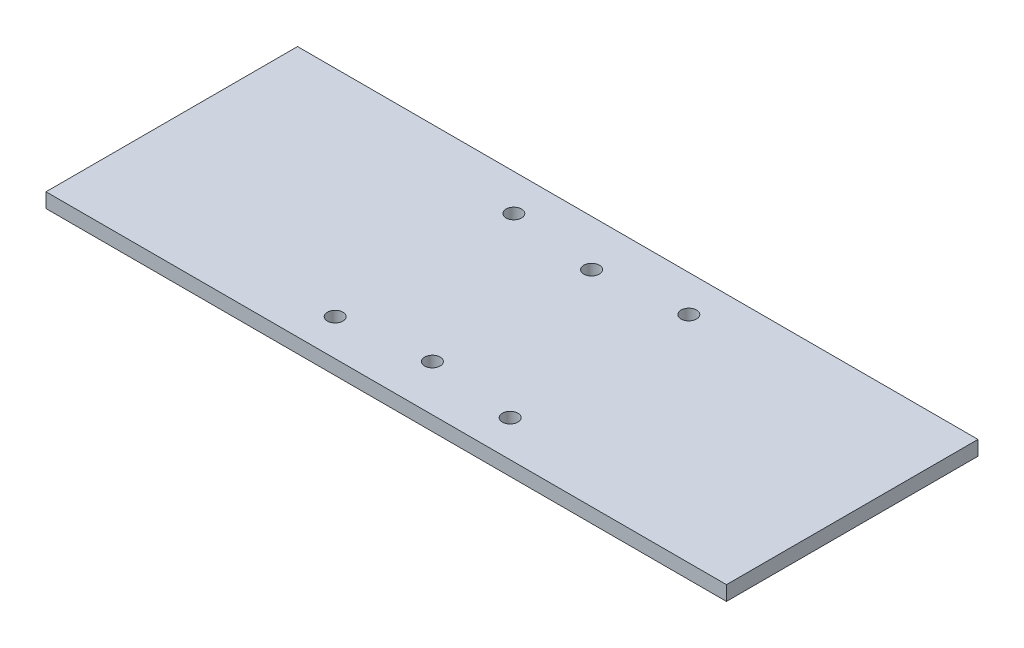
ISO-10303-21;
HEADER;
FILE_DESCRIPTION(('STEP AP214'),'2;1');
FILE_NAME('part.step','',(''),(''),'','','');
FILE_SCHEMA(('AUTOMOTIVE_DESIGN { 1 0 10303 214 1 1 1 1 }'));
ENDSEC;
DATA;
#1=APPLICATION_CONTEXT('core data for automotive mechanical design processes');
#2=APPLICATION_PROTOCOL_DEFINITION('international standard','automotive_design',2000,#1);
#3=PRODUCT_CONTEXT('',#1,'mechanical');
#4=PRODUCT('Part','Part','',(#3));
#5=PRODUCT_RELATED_PRODUCT_CATEGORY('part','',(#4));
#6=PRODUCT_DEFINITION_FORMATION('','',#4);
#7=PRODUCT_DEFINITION_CONTEXT('part definition',#1,'design');
#8=PRODUCT_DEFINITION('design','',#6,#7);
#9=PRODUCT_DEFINITION_SHAPE('','',#8);
#10=(LENGTH_UNIT() NAMED_UNIT(*) SI_UNIT(.MILLI.,.METRE.));
#11=(NAMED_UNIT(*) PLANE_ANGLE_UNIT() SI_UNIT($,.RADIAN.));
#12=(NAMED_UNIT(*) SI_UNIT($,.STERADIAN.) SOLID_ANGLE_UNIT());
#13=UNCERTAINTY_MEASURE_WITH_UNIT(LENGTH_MEASURE(1.E-05),#10,'distance_accuracy_value','');
#14=(GEOMETRIC_REPRESENTATION_CONTEXT(3) GLOBAL_UNCERTAINTY_ASSIGNED_CONTEXT((#13)) GLOBAL_UNIT_ASSIGNED_CONTEXT((#10,
#11,#12)) REPRESENTATION_CONTEXT('',''));
#15=CARTESIAN_POINT('',(0.,0.,0.));
#16=DIRECTION('',(0.,0.,1.));
#17=DIRECTION('',(1.,0.,0.));
#18=AXIS2_PLACEMENT_3D('',#15,#16,#17);
#19=CARTESIAN_POINT('',(-41.9495652376171,3.,-51.75));
#20=DIRECTION('',(1.,0.,0.));
#21=DIRECTION('',(0.,0.,-1.));
#22=AXIS2_PLACEMENT_3D('',#19,#20,#21);
#23=PLANE('',#22);
#24=DIRECTION('',(0.,0.,1.));
#25=VECTOR('',#24,1.);
#26=CARTESIAN_POINT('',(-41.9495652376171,0.,-51.75));
#27=LINE('',#26,#25);
#28=CARTESIAN_POINT('',(-41.9495652376171,0.,-51.75));
#29=VERTEX_POINT('',#28);
#30=CARTESIAN_POINT('',(-41.9495652376171,0.,0.));
#31=VERTEX_POINT('',#30);
#32=EDGE_CURVE('E105',#29,#31,#27,.T.);
#33=ORIENTED_EDGE('',*,*,#32,.T.);
#34=DIRECTION('',(0.,-1.,0.));
#35=VECTOR('',#34,1.);
#36=CARTESIAN_POINT('',(-41.9495652376171,3.,0.));
#37=LINE('',#36,#35);
#38=CARTESIAN_POINT('',(-41.9495652376171,3.,0.));
#39=VERTEX_POINT('',#38);
#40=EDGE_CURVE('E11',#39,#31,#37,.T.);
#41=ORIENTED_EDGE('',*,*,#40,.F.);
#42=DIRECTION('',(0.,0.,1.));
#43=VECTOR('',#42,1.);
#44=CARTESIAN_POINT('',(-41.9495652376171,3.,-51.75));
#45=LINE('',#44,#43);
#46=CARTESIAN_POINT('',(-41.9495652376171,3.,-51.75));
#47=VERTEX_POINT('',#46);
#48=EDGE_CURVE('E92',#47,#39,#45,.T.);
#49=ORIENTED_EDGE('',*,*,#48,.F.);
#50=DIRECTION('',(0.,-1.,0.));
#51=VECTOR('',#50,1.);
#52=CARTESIAN_POINT('',(-41.9495652376171,3.,-51.75));
#53=LINE('',#52,#51);
#54=EDGE_CURVE('E101',#47,#29,#53,.T.);
#55=ORIENTED_EDGE('',*,*,#54,.T.);
#56=EDGE_LOOP('',(#33,#41,#49,#55));
#57=FACE_BOUND('',#56,.T.);
#58=ADVANCED_FACE('F39',(#57),#23,.F.);
#59=CARTESIAN_POINT('',(-41.9495652376171,3.,0.));
#60=DIRECTION('',(0.,0.,-1.));
#61=DIRECTION('',(-1.,0.,0.));
#62=AXIS2_PLACEMENT_3D('',#59,#60,#61);
#63=PLANE('',#62);
#64=DIRECTION('',(1.,0.,0.));
#65=VECTOR('',#64,1.);
#66=CARTESIAN_POINT('',(-41.9495652376171,0.,0.));
#67=LINE('',#66,#65);
#68=CARTESIAN_POINT('',(98.0504347623829,0.,0.));
#69=VERTEX_POINT('',#68);
#70=EDGE_CURVE('E96',#31,#69,#67,.T.);
#71=ORIENTED_EDGE('',*,*,#70,.T.);
#72=DIRECTION('',(0.,-1.,0.));
#73=VECTOR('',#72,1.);
#74=CARTESIAN_POINT('',(98.0504347623829,3.,0.));
#75=LINE('',#74,#73);
#76=CARTESIAN_POINT('',(98.0504347623829,3.,0.));
#77=VERTEX_POINT('',#76);
#78=EDGE_CURVE('E48',#77,#69,#75,.T.);
#79=ORIENTED_EDGE('',*,*,#78,.F.);
#80=DIRECTION('',(1.,0.,0.));
#81=VECTOR('',#80,1.);
#82=CARTESIAN_POINT('',(-41.9495652376171,3.,0.));
#83=LINE('',#82,#81);
#84=EDGE_CURVE('E87',#39,#77,#83,.T.);
#85=ORIENTED_EDGE('',*,*,#84,.F.);
#86=ORIENTED_EDGE('',*,*,#40,.T.);
#87=EDGE_LOOP('',(#71,#79,#85,#86));
#88=FACE_BOUND('',#87,.T.);
#89=ADVANCED_FACE('F95',(#88),#63,.F.);
#90=CARTESIAN_POINT('',(98.0504347623829,3.,-51.75));
#91=DIRECTION('',(-1.,0.,0.));
#92=DIRECTION('',(0.,0.,1.));
#93=AXIS2_PLACEMENT_3D('',#90,#91,#92);
#94=PLANE('',#93);
#95=DIRECTION('',(0.,0.,-1.));
#96=VECTOR('',#95,1.);
#97=CARTESIAN_POINT('',(98.0504347623829,0.,-51.75));
#98=LINE('',#97,#96);
#99=CARTESIAN_POINT('',(98.0504347623829,0.,-51.75));
#100=VERTEX_POINT('',#99);
#101=EDGE_CURVE('E74',#69,#100,#98,.T.);
#102=ORIENTED_EDGE('',*,*,#101,.T.);
#103=DIRECTION('',(0.,-1.,0.));
#104=VECTOR('',#103,1.);
#105=CARTESIAN_POINT('',(98.0504347623829,3.,-51.75));
#106=LINE('',#105,#104);
#107=CARTESIAN_POINT('',(98.0504347623829,3.,-51.75));
#108=VERTEX_POINT('',#107);
#109=EDGE_CURVE('E97',#108,#100,#106,.T.);
#110=ORIENTED_EDGE('',*,*,#109,.F.);
#111=DIRECTION('',(0.,0.,-1.));
#112=VECTOR('',#111,1.);
#113=CARTESIAN_POINT('',(98.0504347623829,3.,-51.75));
#114=LINE('',#113,#112);
#115=EDGE_CURVE('E90',#77,#108,#114,.T.);
#116=ORIENTED_EDGE('',*,*,#115,.F.);
#117=ORIENTED_EDGE('',*,*,#78,.T.);
#118=EDGE_LOOP('',(#102,#110,#116,#117));
#119=FACE_BOUND('',#118,.T.);
#120=ADVANCED_FACE('F99',(#119),#94,.F.);
#121=CARTESIAN_POINT('',(-41.9495652376171,3.,-51.75));
#122=DIRECTION('',(0.,0.,1.));
#123=DIRECTION('',(1.,0.,0.));
#124=AXIS2_PLACEMENT_3D('',#121,#122,#123);
#125=PLANE('',#124);
#126=DIRECTION('',(-1.,0.,0.));
#127=VECTOR('',#126,1.);
#128=CARTESIAN_POINT('',(-41.9495652376171,0.,-51.75));
#129=LINE('',#128,#127);
#130=EDGE_CURVE('E80',#100,#29,#129,.T.);
#131=ORIENTED_EDGE('',*,*,#130,.T.);
#132=ORIENTED_EDGE('',*,*,#54,.F.);
#133=DIRECTION('',(-1.,0.,0.));
#134=VECTOR('',#133,1.);
#135=CARTESIAN_POINT('',(-41.9495652376171,3.,-51.75));
#136=LINE('',#135,#134);
#137=EDGE_CURVE('E57',#108,#47,#136,.T.);
#138=ORIENTED_EDGE('',*,*,#137,.F.);
#139=ORIENTED_EDGE('',*,*,#109,.T.);
#140=EDGE_LOOP('',(#131,#132,#138,#139));
#141=FACE_BOUND('',#140,.T.);
#142=ADVANCED_FACE('F152',(#141),#125,.F.);
#143=CARTESIAN_POINT('',(0.,3.,0.));
#144=DIRECTION('',(0.,1.,0.));
#145=DIRECTION('',(0.,0.,1.));
#146=AXIS2_PLACEMENT_3D('',#143,#144,#145);
#147=PLANE('',#146);
#148=CARTESIAN_POINT('',(10.0504347623829,3.,-44.25));
#149=DIRECTION('',(0.,1.,0.));
#150=DIRECTION('',(0.,0.,1.));
#151=AXIS2_PLACEMENT_3D('',#148,#149,#150);
#152=CIRCLE('',#151,1.6);
#153=CARTESIAN_POINT('',(10.0504347623829,3.,-42.65));
#154=VERTEX_POINT('',#153);
#155=EDGE_CURVE('E293',#154,#154,#152,.T.);
#156=ORIENTED_EDGE('',*,*,#155,.F.);
#157=EDGE_LOOP('',(#156));
#158=FACE_BOUND('',#157,.T.);
#159=CARTESIAN_POINT('',(46.0504347623829,3.,-44.25));
#160=DIRECTION('',(0.,1.,0.));
#161=DIRECTION('',(0.,0.,1.));
#162=AXIS2_PLACEMENT_3D('',#159,#160,#161);
#163=CIRCLE('',#162,1.6);
#164=CARTESIAN_POINT('',(46.0504347623829,3.,-42.65));
#165=VERTEX_POINT('',#164);
#166=EDGE_CURVE('E294',#165,#165,#163,.T.);
#167=ORIENTED_EDGE('',*,*,#166,.F.);
#168=EDGE_LOOP('',(#167));
#169=FACE_BOUND('',#168,.T.);
#170=CARTESIAN_POINT('',(28.0504347623829,3.,-42.25));
#171=DIRECTION('',(0.,1.,0.));
#172=DIRECTION('',(0.,0.,1.));
#173=AXIS2_PLACEMENT_3D('',#170,#171,#172);
#174=CIRCLE('',#173,1.6);
#175=CARTESIAN_POINT('',(28.0504347623829,3.,-40.65));
#176=VERTEX_POINT('',#175);
#177=EDGE_CURVE('E117',#176,#176,#174,.T.);
#178=ORIENTED_EDGE('',*,*,#177,.F.);
#179=EDGE_LOOP('',(#178));
#180=FACE_BOUND('',#179,.T.);
#181=CARTESIAN_POINT('',(10.0504347623829,3.,-7.5));
#182=DIRECTION('',(0.,1.,0.));
#183=DIRECTION('',(0.,0.,1.));
#184=AXIS2_PLACEMENT_3D('',#181,#182,#183);
#185=CIRCLE('',#184,1.6);
#186=CARTESIAN_POINT('',(10.0504347623829,3.,-5.9));
#187=VERTEX_POINT('',#186);
#188=EDGE_CURVE('E108',#187,#187,#185,.T.);
#189=ORIENTED_EDGE('',*,*,#188,.F.);
#190=EDGE_LOOP('',(#189));
#191=FACE_BOUND('',#190,.T.);
#192=CARTESIAN_POINT('',(46.0504347623829,3.,-7.5));
#193=DIRECTION('',(0.,1.,0.));
#194=DIRECTION('',(0.,0.,1.));
#195=AXIS2_PLACEMENT_3D('',#192,#193,#194);
#196=CIRCLE('',#195,1.6);
#197=CARTESIAN_POINT('',(46.0504347623829,3.,-5.9));
#198=VERTEX_POINT('',#197);
#199=EDGE_CURVE('E140',#198,#198,#196,.T.);
#200=ORIENTED_EDGE('',*,*,#199,.F.);
#201=EDGE_LOOP('',(#200));
#202=FACE_BOUND('',#201,.T.);
#203=CARTESIAN_POINT('',(28.0504347623829,3.,-9.5));
#204=DIRECTION('',(0.,1.,0.));
#205=DIRECTION('',(0.,0.,1.));
#206=AXIS2_PLACEMENT_3D('',#203,#204,#205);
#207=CIRCLE('',#206,1.6);
#208=CARTESIAN_POINT('',(28.0504347623829,3.,-7.9));
#209=VERTEX_POINT('',#208);
#210=EDGE_CURVE('E137',#209,#209,#207,.T.);
#211=ORIENTED_EDGE('',*,*,#210,.F.);
#212=EDGE_LOOP('',(#211));
#213=FACE_BOUND('',#212,.T.);
#214=ORIENTED_EDGE('',*,*,#48,.T.);
#215=ORIENTED_EDGE('',*,*,#84,.T.);
#216=ORIENTED_EDGE('',*,*,#115,.T.);
#217=ORIENTED_EDGE('',*,*,#137,.T.);
#218=EDGE_LOOP('',(#214,#215,#216,#217));
#219=FACE_BOUND('',#218,.T.);
#220=ADVANCED_FACE('F88',(#158,#169,#180,#191,#202,#213,#219),#147,.T.);
#221=CARTESIAN_POINT('',(0.,0.,0.));
#222=DIRECTION('',(0.,1.,0.));
#223=DIRECTION('',(0.,0.,1.));
#224=AXIS2_PLACEMENT_3D('',#221,#222,#223);
#225=PLANE('',#224);
#226=CARTESIAN_POINT('',(10.0504347623829,0.,-44.25));
#227=DIRECTION('',(0.,1.,0.));
#228=DIRECTION('',(0.,0.,1.));
#229=AXIS2_PLACEMENT_3D('',#226,#227,#228);
#230=CIRCLE('',#229,1.6);
#231=CARTESIAN_POINT('',(10.0504347623829,0.,-42.65));
#232=VERTEX_POINT('',#231);
#233=EDGE_CURVE('E42',#232,#232,#230,.T.);
#234=ORIENTED_EDGE('',*,*,#233,.T.);
#235=EDGE_LOOP('',(#234));
#236=FACE_BOUND('',#235,.T.);
#237=CARTESIAN_POINT('',(46.0504347623829,0.,-44.25));
#238=DIRECTION('',(0.,1.,0.));
#239=DIRECTION('',(0.,0.,1.));
#240=AXIS2_PLACEMENT_3D('',#237,#238,#239);
#241=CIRCLE('',#240,1.6);
#242=CARTESIAN_POINT('',(46.0504347623829,0.,-42.65));
#243=VERTEX_POINT('',#242);
#244=EDGE_CURVE('E116',#243,#243,#241,.T.);
#245=ORIENTED_EDGE('',*,*,#244,.T.);
#246=EDGE_LOOP('',(#245));
#247=FACE_BOUND('',#246,.T.);
#248=CARTESIAN_POINT('',(28.0504347623829,0.,-42.25));
#249=DIRECTION('',(0.,1.,0.));
#250=DIRECTION('',(0.,0.,1.));
#251=AXIS2_PLACEMENT_3D('',#248,#249,#250);
#252=CIRCLE('',#251,1.6);
#253=CARTESIAN_POINT('',(28.0504347623829,0.,-40.65));
#254=VERTEX_POINT('',#253);
#255=EDGE_CURVE('E114',#254,#254,#252,.T.);
#256=ORIENTED_EDGE('',*,*,#255,.T.);
#257=EDGE_LOOP('',(#256));
#258=FACE_BOUND('',#257,.T.);
#259=CARTESIAN_POINT('',(10.0504347623829,0.,-7.5));
#260=DIRECTION('',(0.,1.,0.));
#261=DIRECTION('',(0.,0.,1.));
#262=AXIS2_PLACEMENT_3D('',#259,#260,#261);
#263=CIRCLE('',#262,1.6);
#264=CARTESIAN_POINT('',(10.0504347623829,0.,-5.9));
#265=VERTEX_POINT('',#264);
#266=EDGE_CURVE('E122',#265,#265,#263,.T.);
#267=ORIENTED_EDGE('',*,*,#266,.T.);
#268=EDGE_LOOP('',(#267));
#269=FACE_BOUND('',#268,.T.);
#270=CARTESIAN_POINT('',(46.0504347623829,0.,-7.5));
#271=DIRECTION('',(0.,1.,0.));
#272=DIRECTION('',(0.,0.,1.));
#273=AXIS2_PLACEMENT_3D('',#270,#271,#272);
#274=CIRCLE('',#273,1.6);
#275=CARTESIAN_POINT('',(46.0504347623829,0.,-5.9));
#276=VERTEX_POINT('',#275);
#277=EDGE_CURVE('E126',#276,#276,#274,.T.);
#278=ORIENTED_EDGE('',*,*,#277,.T.);
#279=EDGE_LOOP('',(#278));
#280=FACE_BOUND('',#279,.T.);
#281=CARTESIAN_POINT('',(28.0504347623829,0.,-9.5));
#282=DIRECTION('',(0.,1.,0.));
#283=DIRECTION('',(0.,0.,1.));
#284=AXIS2_PLACEMENT_3D('',#281,#282,#283);
#285=CIRCLE('',#284,1.6);
#286=CARTESIAN_POINT('',(28.0504347623829,0.,-7.9));
#287=VERTEX_POINT('',#286);
#288=EDGE_CURVE('E131',#287,#287,#285,.T.);
#289=ORIENTED_EDGE('',*,*,#288,.T.);
#290=EDGE_LOOP('',(#289));
#291=FACE_BOUND('',#290,.T.);
#292=ORIENTED_EDGE('',*,*,#32,.F.);
#293=ORIENTED_EDGE('',*,*,#130,.F.);
#294=ORIENTED_EDGE('',*,*,#101,.F.);
#295=ORIENTED_EDGE('',*,*,#70,.F.);
#296=EDGE_LOOP('',(#292,#293,#294,#295));
#297=FACE_BOUND('',#296,.T.);
#298=ADVANCED_FACE('F151',(#236,#247,#258,#269,#280,#291,#297),#225,.F.);
#299=CARTESIAN_POINT('',(28.0504347623829,0.,-9.5));
#300=DIRECTION('',(0.,1.,0.));
#301=DIRECTION('',(0.,0.,1.));
#302=AXIS2_PLACEMENT_3D('',#299,#300,#301);
#303=CYLINDRICAL_SURFACE('',#302,1.6);
#304=ORIENTED_EDGE('',*,*,#210,.T.);
#305=EDGE_LOOP('',(#304));
#306=FACE_BOUND('',#305,.T.);
#307=ORIENTED_EDGE('',*,*,#288,.F.);
#308=EDGE_LOOP('',(#307));
#309=FACE_BOUND('',#308,.T.);
#310=ADVANCED_FACE('F159',(#306,#309),#303,.F.);
#311=CARTESIAN_POINT('',(46.0504347623829,0.,-7.5));
#312=DIRECTION('',(0.,1.,0.));
#313=DIRECTION('',(0.,0.,1.));
#314=AXIS2_PLACEMENT_3D('',#311,#312,#313);
#315=CYLINDRICAL_SURFACE('',#314,1.6);
#316=ORIENTED_EDGE('',*,*,#199,.T.);
#317=EDGE_LOOP('',(#316));
#318=FACE_BOUND('',#317,.T.);
#319=ORIENTED_EDGE('',*,*,#277,.F.);
#320=EDGE_LOOP('',(#319));
#321=FACE_BOUND('',#320,.T.);
#322=ADVANCED_FACE('F162',(#318,#321),#315,.F.);
#323=CARTESIAN_POINT('',(10.0504347623829,0.,-7.5));
#324=DIRECTION('',(0.,1.,0.));
#325=DIRECTION('',(0.,0.,1.));
#326=AXIS2_PLACEMENT_3D('',#323,#324,#325);
#327=CYLINDRICAL_SURFACE('',#326,1.6);
#328=ORIENTED_EDGE('',*,*,#188,.T.);
#329=EDGE_LOOP('',(#328));
#330=FACE_BOUND('',#329,.T.);
#331=ORIENTED_EDGE('',*,*,#266,.F.);
#332=EDGE_LOOP('',(#331));
#333=FACE_BOUND('',#332,.T.);
#334=ADVANCED_FACE('F146',(#330,#333),#327,.F.);
#335=CARTESIAN_POINT('',(28.0504347623829,-7.,-42.25));
#336=DIRECTION('',(0.,1.,0.));
#337=DIRECTION('',(0.,0.,1.));
#338=AXIS2_PLACEMENT_3D('',#335,#336,#337);
#339=CYLINDRICAL_SURFACE('',#338,1.6);
#340=ORIENTED_EDGE('',*,*,#177,.T.);
#341=EDGE_LOOP('',(#340));
#342=FACE_BOUND('',#341,.T.);
#343=ORIENTED_EDGE('',*,*,#255,.F.);
#344=EDGE_LOOP('',(#343));
#345=FACE_BOUND('',#344,.T.);
#346=ADVANCED_FACE('F221',(#342,#345),#339,.F.);
#347=CARTESIAN_POINT('',(46.0504347623829,-7.,-44.25));
#348=DIRECTION('',(0.,1.,0.));
#349=DIRECTION('',(0.,0.,1.));
#350=AXIS2_PLACEMENT_3D('',#347,#348,#349);
#351=CYLINDRICAL_SURFACE('',#350,1.6);
#352=ORIENTED_EDGE('',*,*,#166,.T.);
#353=EDGE_LOOP('',(#352));
#354=FACE_BOUND('',#353,.T.);
#355=ORIENTED_EDGE('',*,*,#244,.F.);
#356=EDGE_LOOP('',(#355));
#357=FACE_BOUND('',#356,.T.);
#358=ADVANCED_FACE('F243',(#354,#357),#351,.F.);
#359=CARTESIAN_POINT('',(10.0504347623829,-7.,-44.25));
#360=DIRECTION('',(0.,1.,0.));
#361=DIRECTION('',(0.,0.,1.));
#362=AXIS2_PLACEMENT_3D('',#359,#360,#361);
#363=CYLINDRICAL_SURFACE('',#362,1.6);
#364=ORIENTED_EDGE('',*,*,#155,.T.);
#365=EDGE_LOOP('',(#364));
#366=FACE_BOUND('',#365,.T.);
#367=ORIENTED_EDGE('',*,*,#233,.F.);
#368=EDGE_LOOP('',(#367));
#369=FACE_BOUND('',#368,.T.);
#370=ADVANCED_FACE('F254',(#366,#369),#363,.F.);
#371=CLOSED_SHELL('',(#58,#89,#120,#142,#220,#298,#310,#322,#334,#346,#358,#370));
#372=MANIFOLD_SOLID_BREP('B2',#371);
#373=ADVANCED_BREP_SHAPE_REPRESENTATION('',(#18,#372),#14);
#374=SHAPE_DEFINITION_REPRESENTATION(#9,#373);
ENDSEC;
END-ISO-10303-21;
